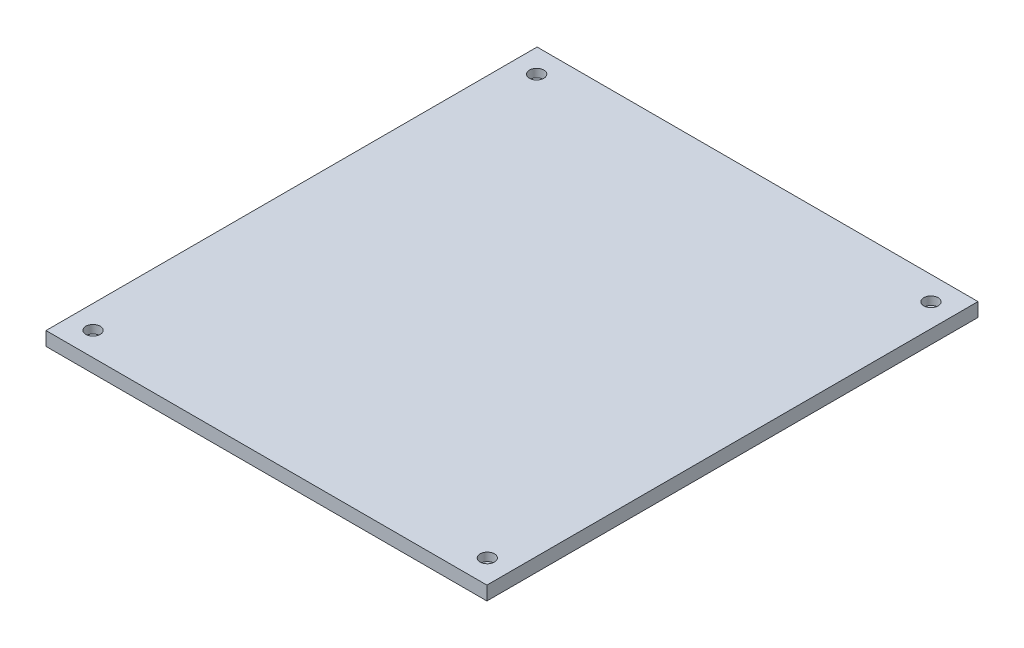
ISO-10303-21;
HEADER;
FILE_DESCRIPTION(('STEP AP214'),'2;1');
FILE_NAME('part.step','',(''),(''),'','','');
FILE_SCHEMA(('AUTOMOTIVE_DESIGN { 1 0 10303 214 1 1 1 1 }'));
ENDSEC;
DATA;
#1=APPLICATION_CONTEXT('core data for automotive mechanical design processes');
#2=APPLICATION_PROTOCOL_DEFINITION('international standard','automotive_design',2000,#1);
#3=PRODUCT_CONTEXT('',#1,'mechanical');
#4=PRODUCT('Part','Part','',(#3));
#5=PRODUCT_RELATED_PRODUCT_CATEGORY('part','',(#4));
#6=PRODUCT_DEFINITION_FORMATION('','',#4);
#7=PRODUCT_DEFINITION_CONTEXT('part definition',#1,'design');
#8=PRODUCT_DEFINITION('design','',#6,#7);
#9=PRODUCT_DEFINITION_SHAPE('','',#8);
#10=(LENGTH_UNIT() NAMED_UNIT(*) SI_UNIT(.MILLI.,.METRE.));
#11=(NAMED_UNIT(*) PLANE_ANGLE_UNIT() SI_UNIT($,.RADIAN.));
#12=(NAMED_UNIT(*) SI_UNIT($,.STERADIAN.) SOLID_ANGLE_UNIT());
#13=UNCERTAINTY_MEASURE_WITH_UNIT(LENGTH_MEASURE(1.E-05),#10,'distance_accuracy_value','');
#14=(GEOMETRIC_REPRESENTATION_CONTEXT(3) GLOBAL_UNCERTAINTY_ASSIGNED_CONTEXT((#13)) GLOBAL_UNIT_ASSIGNED_CONTEXT((#10,
#11,#12)) REPRESENTATION_CONTEXT('',''));
#15=CARTESIAN_POINT('',(0.,0.,0.));
#16=DIRECTION('',(0.,0.,1.));
#17=DIRECTION('',(1.,0.,0.));
#18=AXIS2_PLACEMENT_3D('',#15,#16,#17);
#19=CARTESIAN_POINT('',(71.5387795707747,5.,80.4966827827485));
#20=DIRECTION('',(0.,-1.,0.));
#21=DIRECTION('',(0.,0.,-1.));
#22=AXIS2_PLACEMENT_3D('',#19,#20,#21);
#23=CYLINDRICAL_SURFACE('',#22,1.5);
#24=CARTESIAN_POINT('',(71.5387795707747,0.,80.4966827827485));
#25=DIRECTION('',(0.,1.,0.));
#26=DIRECTION('',(0.,0.,1.));
#27=AXIS2_PLACEMENT_3D('',#24,#25,#26);
#28=CIRCLE('',#27,1.5);
#29=CARTESIAN_POINT('',(71.5387795707747,0.,81.9966827827485));
#30=VERTEX_POINT('',#29);
#31=EDGE_CURVE('E124',#30,#30,#28,.T.);
#32=ORIENTED_EDGE('',*,*,#31,.F.);
#33=EDGE_LOOP('',(#32));
#34=FACE_BOUND('',#33,.T.);
#35=CARTESIAN_POINT('',(71.5387795707747,2.,80.4966827827485));
#36=DIRECTION('',(0.,1.,0.));
#37=DIRECTION('',(0.,0.,1.));
#38=AXIS2_PLACEMENT_3D('',#35,#36,#37);
#39=CIRCLE('',#38,1.5);
#40=CARTESIAN_POINT('',(71.5387795707747,2.,81.9966827827485));
#41=VERTEX_POINT('',#40);
#42=EDGE_CURVE('E45',#41,#41,#39,.T.);
#43=ORIENTED_EDGE('',*,*,#42,.T.);
#44=EDGE_LOOP('',(#43));
#45=FACE_BOUND('',#44,.T.);
#46=ADVANCED_FACE('F41',(#34,#45),#23,.F.);
#47=CARTESIAN_POINT('',(-71.5387795707747,5.,-80.4966827827486));
#48=DIRECTION('',(0.,-1.,0.));
#49=DIRECTION('',(0.,0.,-1.));
#50=AXIS2_PLACEMENT_3D('',#47,#48,#49);
#51=CYLINDRICAL_SURFACE('',#50,1.5);
#52=CARTESIAN_POINT('',(-71.5387795707747,0.,-80.4966827827486));
#53=DIRECTION('',(0.,1.,0.));
#54=DIRECTION('',(0.,0.,1.));
#55=AXIS2_PLACEMENT_3D('',#52,#53,#54);
#56=CIRCLE('',#55,1.5);
#57=CARTESIAN_POINT('',(-71.5387795707747,0.,-78.9966827827486));
#58=VERTEX_POINT('',#57);
#59=EDGE_CURVE('E115',#58,#58,#56,.T.);
#60=ORIENTED_EDGE('',*,*,#59,.F.);
#61=EDGE_LOOP('',(#60));
#62=FACE_BOUND('',#61,.T.);
#63=CARTESIAN_POINT('',(-71.5387795707747,2.,-80.4966827827486));
#64=DIRECTION('',(0.,1.,0.));
#65=DIRECTION('',(0.,0.,1.));
#66=AXIS2_PLACEMENT_3D('',#63,#64,#65);
#67=CIRCLE('',#66,1.5);
#68=CARTESIAN_POINT('',(-71.5387795707747,2.,-78.9966827827486));
#69=VERTEX_POINT('',#68);
#70=EDGE_CURVE('E137',#69,#69,#67,.T.);
#71=ORIENTED_EDGE('',*,*,#70,.T.);
#72=EDGE_LOOP('',(#71));
#73=FACE_BOUND('',#72,.T.);
#74=ADVANCED_FACE('F195',(#62,#73),#51,.F.);
#75=CARTESIAN_POINT('',(80.,5.,0.));
#76=DIRECTION('',(1.,0.,0.));
#77=DIRECTION('',(0.,0.,-1.));
#78=AXIS2_PLACEMENT_3D('',#75,#76,#77);
#79=PLANE('',#78);
#80=DIRECTION('',(0.,0.,1.));
#81=VECTOR('',#80,1.);
#82=CARTESIAN_POINT('',(80.,0.,0.));
#83=LINE('',#82,#81);
#84=CARTESIAN_POINT('',(80.,0.,-89.105));
#85=VERTEX_POINT('',#84);
#86=CARTESIAN_POINT('',(80.,0.,89.105));
#87=VERTEX_POINT('',#86);
#88=EDGE_CURVE('E118',#85,#87,#83,.T.);
#89=ORIENTED_EDGE('',*,*,#88,.F.);
#90=DIRECTION('',(0.,-1.,0.));
#91=VECTOR('',#90,1.);
#92=CARTESIAN_POINT('',(80.,5.,-89.105));
#93=LINE('',#92,#91);
#94=CARTESIAN_POINT('',(80.,5.,-89.105));
#95=VERTEX_POINT('',#94);
#96=EDGE_CURVE('E11',#95,#85,#93,.T.);
#97=ORIENTED_EDGE('',*,*,#96,.F.);
#98=DIRECTION('',(0.,0.,1.));
#99=VECTOR('',#98,1.);
#100=CARTESIAN_POINT('',(80.,5.,0.));
#101=LINE('',#100,#99);
#102=CARTESIAN_POINT('',(80.,5.,89.105));
#103=VERTEX_POINT('',#102);
#104=EDGE_CURVE('E105',#95,#103,#101,.T.);
#105=ORIENTED_EDGE('',*,*,#104,.T.);
#106=DIRECTION('',(0.,-1.,0.));
#107=VECTOR('',#106,1.);
#108=CARTESIAN_POINT('',(80.,5.,89.105));
#109=LINE('',#108,#107);
#110=EDGE_CURVE('E83',#103,#87,#109,.T.);
#111=ORIENTED_EDGE('',*,*,#110,.T.);
#112=EDGE_LOOP('',(#89,#97,#105,#111));
#113=FACE_BOUND('',#112,.T.);
#114=ADVANCED_FACE('F201',(#113),#79,.T.);
#115=CARTESIAN_POINT('',(0.,5.,-89.105));
#116=DIRECTION('',(0.,0.,-1.));
#117=DIRECTION('',(-1.,0.,0.));
#118=AXIS2_PLACEMENT_3D('',#115,#116,#117);
#119=PLANE('',#118);
#120=DIRECTION('',(1.,0.,0.));
#121=VECTOR('',#120,1.);
#122=CARTESIAN_POINT('',(0.,0.,-89.105));
#123=LINE('',#122,#121);
#124=CARTESIAN_POINT('',(-80.,0.,-89.105));
#125=VERTEX_POINT('',#124);
#126=EDGE_CURVE('E95',#125,#85,#123,.T.);
#127=ORIENTED_EDGE('',*,*,#126,.F.);
#128=DIRECTION('',(0.,-1.,0.));
#129=VECTOR('',#128,1.);
#130=CARTESIAN_POINT('',(-80.,5.,-89.105));
#131=LINE('',#130,#129);
#132=CARTESIAN_POINT('',(-80.,5.,-89.105));
#133=VERTEX_POINT('',#132);
#134=EDGE_CURVE('E51',#133,#125,#131,.T.);
#135=ORIENTED_EDGE('',*,*,#134,.F.);
#136=DIRECTION('',(1.,0.,0.));
#137=VECTOR('',#136,1.);
#138=CARTESIAN_POINT('',(0.,5.,-89.105));
#139=LINE('',#138,#137);
#140=EDGE_CURVE('E93',#133,#95,#139,.T.);
#141=ORIENTED_EDGE('',*,*,#140,.T.);
#142=ORIENTED_EDGE('',*,*,#96,.T.);
#143=EDGE_LOOP('',(#127,#135,#141,#142));
#144=FACE_BOUND('',#143,.T.);
#145=ADVANCED_FACE('F91',(#144),#119,.T.);
#146=CARTESIAN_POINT('',(-80.,5.,0.));
#147=DIRECTION('',(1.,0.,0.));
#148=DIRECTION('',(0.,0.,-1.));
#149=AXIS2_PLACEMENT_3D('',#146,#147,#148);
#150=PLANE('',#149);
#151=DIRECTION('',(0.,0.,1.));
#152=VECTOR('',#151,1.);
#153=CARTESIAN_POINT('',(-80.,0.,0.));
#154=LINE('',#153,#152);
#155=CARTESIAN_POINT('',(-80.,0.,89.105));
#156=VERTEX_POINT('',#155);
#157=EDGE_CURVE('E121',#125,#156,#154,.T.);
#158=ORIENTED_EDGE('',*,*,#157,.T.);
#159=DIRECTION('',(0.,-1.,0.));
#160=VECTOR('',#159,1.);
#161=CARTESIAN_POINT('',(-80.,5.,89.105));
#162=LINE('',#161,#160);
#163=CARTESIAN_POINT('',(-80.,5.,89.105));
#164=VERTEX_POINT('',#163);
#165=EDGE_CURVE('E98',#164,#156,#162,.T.);
#166=ORIENTED_EDGE('',*,*,#165,.F.);
#167=DIRECTION('',(0.,0.,1.));
#168=VECTOR('',#167,1.);
#169=CARTESIAN_POINT('',(-80.,5.,0.));
#170=LINE('',#169,#168);
#171=EDGE_CURVE('E101',#133,#164,#170,.T.);
#172=ORIENTED_EDGE('',*,*,#171,.F.);
#173=ORIENTED_EDGE('',*,*,#134,.T.);
#174=EDGE_LOOP('',(#158,#166,#172,#173));
#175=FACE_BOUND('',#174,.T.);
#176=ADVANCED_FACE('F102',(#175),#150,.F.);
#177=CARTESIAN_POINT('',(0.,5.,89.105));
#178=DIRECTION('',(0.,0.,-1.));
#179=DIRECTION('',(-1.,0.,0.));
#180=AXIS2_PLACEMENT_3D('',#177,#178,#179);
#181=PLANE('',#180);
#182=DIRECTION('',(1.,0.,0.));
#183=VECTOR('',#182,1.);
#184=CARTESIAN_POINT('',(0.,0.,89.105));
#185=LINE('',#184,#183);
#186=EDGE_CURVE('E76',#156,#87,#185,.T.);
#187=ORIENTED_EDGE('',*,*,#186,.T.);
#188=ORIENTED_EDGE('',*,*,#110,.F.);
#189=DIRECTION('',(1.,0.,0.));
#190=VECTOR('',#189,1.);
#191=CARTESIAN_POINT('',(0.,5.,89.105));
#192=LINE('',#191,#190);
#193=EDGE_CURVE('E60',#164,#103,#192,.T.);
#194=ORIENTED_EDGE('',*,*,#193,.F.);
#195=ORIENTED_EDGE('',*,*,#165,.T.);
#196=EDGE_LOOP('',(#187,#188,#194,#195));
#197=FACE_BOUND('',#196,.T.);
#198=ADVANCED_FACE('F208',(#197),#181,.F.);
#199=CARTESIAN_POINT('',(71.5387795707748,5.,-80.4966827827485));
#200=DIRECTION('',(0.,-1.,0.));
#201=DIRECTION('',(0.,0.,-1.));
#202=AXIS2_PLACEMENT_3D('',#199,#200,#201);
#203=CYLINDRICAL_SURFACE('',#202,1.5);
#204=CARTESIAN_POINT('',(71.5387795707748,2.,-80.4966827827485));
#205=DIRECTION('',(0.,-1.,0.));
#206=DIRECTION('',(0.,0.,-1.));
#207=AXIS2_PLACEMENT_3D('',#204,#205,#206);
#208=CIRCLE('',#207,1.5);
#209=CARTESIAN_POINT('',(71.5387795707748,2.,-81.9966827827485));
#210=VERTEX_POINT('',#209);
#211=EDGE_CURVE('E134',#210,#210,#208,.F.);
#212=ORIENTED_EDGE('',*,*,#211,.T.);
#213=EDGE_LOOP('',(#212));
#214=FACE_BOUND('',#213,.T.);
#215=CARTESIAN_POINT('',(71.5387795707748,0.,-80.4966827827485));
#216=DIRECTION('',(0.,1.,0.));
#217=DIRECTION('',(0.,0.,1.));
#218=AXIS2_PLACEMENT_3D('',#215,#216,#217);
#219=CIRCLE('',#218,1.5);
#220=CARTESIAN_POINT('',(71.5387795707748,0.,-78.9966827827485));
#221=VERTEX_POINT('',#220);
#222=EDGE_CURVE('E112',#221,#221,#219,.F.);
#223=ORIENTED_EDGE('',*,*,#222,.T.);
#224=EDGE_LOOP('',(#223));
#225=FACE_BOUND('',#224,.T.);
#226=ADVANCED_FACE('F43',(#214,#225),#203,.F.);
#227=CARTESIAN_POINT('',(-71.5387795707747,5.,80.4966827827485));
#228=DIRECTION('',(0.,-1.,0.));
#229=DIRECTION('',(0.,0.,-1.));
#230=AXIS2_PLACEMENT_3D('',#227,#228,#229);
#231=CYLINDRICAL_SURFACE('',#230,1.5);
#232=CARTESIAN_POINT('',(-71.5387795707747,2.,80.4966827827485));
#233=DIRECTION('',(0.,-1.,0.));
#234=DIRECTION('',(0.,0.,-1.));
#235=AXIS2_PLACEMENT_3D('',#232,#233,#234);
#236=CIRCLE('',#235,1.5);
#237=CARTESIAN_POINT('',(-71.5387795707747,2.,78.9966827827485));
#238=VERTEX_POINT('',#237);
#239=EDGE_CURVE('E131',#238,#238,#236,.F.);
#240=ORIENTED_EDGE('',*,*,#239,.T.);
#241=EDGE_LOOP('',(#240));
#242=FACE_BOUND('',#241,.T.);
#243=CARTESIAN_POINT('',(-71.5387795707747,0.,80.4966827827485));
#244=DIRECTION('',(0.,1.,0.));
#245=DIRECTION('',(0.,0.,1.));
#246=AXIS2_PLACEMENT_3D('',#243,#244,#245);
#247=CIRCLE('',#246,1.5);
#248=CARTESIAN_POINT('',(-71.5387795707747,0.,81.9966827827485));
#249=VERTEX_POINT('',#248);
#250=EDGE_CURVE('E107',#249,#249,#247,.F.);
#251=ORIENTED_EDGE('',*,*,#250,.T.);
#252=EDGE_LOOP('',(#251));
#253=FACE_BOUND('',#252,.T.);
#254=ADVANCED_FACE('F206',(#242,#253),#231,.F.);
#255=CARTESIAN_POINT('',(0.,5.,0.));
#256=DIRECTION('',(0.,1.,0.));
#257=DIRECTION('',(0.,0.,1.));
#258=AXIS2_PLACEMENT_3D('',#255,#256,#257);
#259=PLANE('',#258);
#260=CARTESIAN_POINT('',(-71.5387795707747,5.,80.4966827827486));
#261=DIRECTION('',(0.,1.,0.));
#262=DIRECTION('',(0.,0.,-1.));
#263=AXIS2_PLACEMENT_3D('',#260,#261,#262);
#264=CIRCLE('',#263,2.6);
#265=CARTESIAN_POINT('',(-71.5387795707747,5.,77.8966827827486));
#266=VERTEX_POINT('',#265);
#267=EDGE_CURVE('E156',#266,#266,#264,.T.);
#268=ORIENTED_EDGE('',*,*,#267,.F.);
#269=EDGE_LOOP('',(#268));
#270=FACE_BOUND('',#269,.T.);
#271=CARTESIAN_POINT('',(71.5387795707747,5.,80.4966827827486));
#272=DIRECTION('',(0.,1.,0.));
#273=DIRECTION('',(0.,0.,1.));
#274=AXIS2_PLACEMENT_3D('',#271,#272,#273);
#275=CIRCLE('',#274,2.6);
#276=CARTESIAN_POINT('',(71.5387795707747,5.,83.0966827827486));
#277=VERTEX_POINT('',#276);
#278=EDGE_CURVE('E155',#277,#277,#275,.T.);
#279=ORIENTED_EDGE('',*,*,#278,.F.);
#280=EDGE_LOOP('',(#279));
#281=FACE_BOUND('',#280,.T.);
#282=CARTESIAN_POINT('',(71.5387795707747,5.,-80.4966827827486));
#283=DIRECTION('',(0.,1.,0.));
#284=DIRECTION('',(0.,0.,-1.));
#285=AXIS2_PLACEMENT_3D('',#282,#283,#284);
#286=CIRCLE('',#285,2.6);
#287=CARTESIAN_POINT('',(71.5387795707747,5.,-83.0966827827486));
#288=VERTEX_POINT('',#287);
#289=EDGE_CURVE('E171',#288,#288,#286,.T.);
#290=ORIENTED_EDGE('',*,*,#289,.F.);
#291=EDGE_LOOP('',(#290));
#292=FACE_BOUND('',#291,.T.);
#293=CARTESIAN_POINT('',(-71.5387795707747,5.,-80.4966827827486));
#294=DIRECTION('',(0.,1.,0.));
#295=DIRECTION('',(0.,0.,1.));
#296=AXIS2_PLACEMENT_3D('',#293,#294,#295);
#297=CIRCLE('',#296,2.6);
#298=CARTESIAN_POINT('',(-71.5387795707747,5.,-77.8966827827486));
#299=VERTEX_POINT('',#298);
#300=EDGE_CURVE('E169',#299,#299,#297,.T.);
#301=ORIENTED_EDGE('',*,*,#300,.F.);
#302=EDGE_LOOP('',(#301));
#303=FACE_BOUND('',#302,.T.);
#304=ORIENTED_EDGE('',*,*,#104,.F.);
#305=ORIENTED_EDGE('',*,*,#140,.F.);
#306=ORIENTED_EDGE('',*,*,#171,.T.);
#307=ORIENTED_EDGE('',*,*,#193,.T.);
#308=EDGE_LOOP('',(#304,#305,#306,#307));
#309=FACE_BOUND('',#308,.T.);
#310=ADVANCED_FACE('F104',(#270,#281,#292,#303,#309),#259,.T.);
#311=CARTESIAN_POINT('',(0.,0.,0.));
#312=DIRECTION('',(0.,1.,0.));
#313=DIRECTION('',(0.,0.,1.));
#314=AXIS2_PLACEMENT_3D('',#311,#312,#313);
#315=PLANE('',#314);
#316=ORIENTED_EDGE('',*,*,#222,.F.);
#317=EDGE_LOOP('',(#316));
#318=FACE_BOUND('',#317,.T.);
#319=ORIENTED_EDGE('',*,*,#59,.T.);
#320=EDGE_LOOP('',(#319));
#321=FACE_BOUND('',#320,.T.);
#322=ORIENTED_EDGE('',*,*,#88,.T.);
#323=ORIENTED_EDGE('',*,*,#186,.F.);
#324=ORIENTED_EDGE('',*,*,#157,.F.);
#325=ORIENTED_EDGE('',*,*,#126,.T.);
#326=EDGE_LOOP('',(#322,#323,#324,#325));
#327=FACE_BOUND('',#326,.T.);
#328=ORIENTED_EDGE('',*,*,#31,.T.);
#329=EDGE_LOOP('',(#328));
#330=FACE_BOUND('',#329,.T.);
#331=ORIENTED_EDGE('',*,*,#250,.F.);
#332=EDGE_LOOP('',(#331));
#333=FACE_BOUND('',#332,.T.);
#334=ADVANCED_FACE('F219',(#318,#321,#327,#330,#333),#315,.F.);
#335=CARTESIAN_POINT('',(-71.5387795707747,2.,-80.4966827827486));
#336=DIRECTION('',(0.,1.,0.));
#337=DIRECTION('',(0.,0.,1.));
#338=AXIS2_PLACEMENT_3D('',#335,#336,#337);
#339=CYLINDRICAL_SURFACE('',#338,2.6);
#340=CARTESIAN_POINT('',(-71.5387795707747,2.,-80.4966827827486));
#341=DIRECTION('',(0.,1.,0.));
#342=DIRECTION('',(0.,0.,1.));
#343=AXIS2_PLACEMENT_3D('',#340,#341,#342);
#344=CIRCLE('',#343,2.6);
#345=CARTESIAN_POINT('',(-71.5387795707747,2.,-77.8966827827486));
#346=VERTEX_POINT('',#345);
#347=EDGE_CURVE('E135',#346,#346,#344,.T.);
#348=ORIENTED_EDGE('',*,*,#347,.F.);
#349=EDGE_LOOP('',(#348));
#350=FACE_BOUND('',#349,.T.);
#351=ORIENTED_EDGE('',*,*,#300,.T.);
#352=EDGE_LOOP('',(#351));
#353=FACE_BOUND('',#352,.T.);
#354=ADVANCED_FACE('F222',(#350,#353),#339,.F.);
#355=CARTESIAN_POINT('',(-71.5387795707747,2.,-80.4966827827486));
#356=DIRECTION('',(0.,1.,0.));
#357=DIRECTION('',(0.,0.,1.));
#358=AXIS2_PLACEMENT_3D('',#355,#356,#357);
#359=PLANE('',#358);
#360=ORIENTED_EDGE('',*,*,#70,.F.);
#361=EDGE_LOOP('',(#360));
#362=FACE_BOUND('',#361,.T.);
#363=ORIENTED_EDGE('',*,*,#347,.T.);
#364=EDGE_LOOP('',(#363));
#365=FACE_BOUND('',#364,.T.);
#366=ADVANCED_FACE('F192',(#362,#365),#359,.T.);
#367=CARTESIAN_POINT('',(71.5387795707747,2.,-80.4966827827486));
#368=DIRECTION('',(0.,-1.,0.));
#369=DIRECTION('',(0.,0.,-1.));
#370=AXIS2_PLACEMENT_3D('',#367,#368,#369);
#371=PLANE('',#370);
#372=CARTESIAN_POINT('',(71.5387795707747,2.,-80.4966827827486));
#373=DIRECTION('',(0.,1.,0.));
#374=DIRECTION('',(0.,0.,-1.));
#375=AXIS2_PLACEMENT_3D('',#372,#373,#374);
#376=CIRCLE('',#375,2.6);
#377=CARTESIAN_POINT('',(71.5387795707747,2.,-83.0966827827486));
#378=VERTEX_POINT('',#377);
#379=EDGE_CURVE('E159',#378,#378,#376,.T.);
#380=ORIENTED_EDGE('',*,*,#379,.T.);
#381=EDGE_LOOP('',(#380));
#382=FACE_BOUND('',#381,.T.);
#383=ORIENTED_EDGE('',*,*,#211,.F.);
#384=EDGE_LOOP('',(#383));
#385=FACE_BOUND('',#384,.T.);
#386=ADVANCED_FACE('F181',(#382,#385),#371,.F.);
#387=CARTESIAN_POINT('',(71.5387795707747,2.,-80.4966827827486));
#388=DIRECTION('',(0.,1.,0.));
#389=DIRECTION('',(0.,0.,1.));
#390=AXIS2_PLACEMENT_3D('',#387,#388,#389);
#391=CYLINDRICAL_SURFACE('',#390,2.6);
#392=ORIENTED_EDGE('',*,*,#379,.F.);
#393=EDGE_LOOP('',(#392));
#394=FACE_BOUND('',#393,.T.);
#395=ORIENTED_EDGE('',*,*,#289,.T.);
#396=EDGE_LOOP('',(#395));
#397=FACE_BOUND('',#396,.T.);
#398=ADVANCED_FACE('F184',(#394,#397),#391,.F.);
#399=CARTESIAN_POINT('',(71.5387795707747,2.,80.4966827827486));
#400=DIRECTION('',(0.,1.,0.));
#401=DIRECTION('',(0.,0.,1.));
#402=AXIS2_PLACEMENT_3D('',#399,#400,#401);
#403=CYLINDRICAL_SURFACE('',#402,2.6);
#404=CARTESIAN_POINT('',(71.5387795707747,2.,80.4966827827486));
#405=DIRECTION('',(0.,1.,0.));
#406=DIRECTION('',(0.,0.,1.));
#407=AXIS2_PLACEMENT_3D('',#404,#405,#406);
#408=CIRCLE('',#407,2.6);
#409=CARTESIAN_POINT('',(71.5387795707747,2.,83.0966827827486));
#410=VERTEX_POINT('',#409);
#411=EDGE_CURVE('E153',#410,#410,#408,.T.);
#412=ORIENTED_EDGE('',*,*,#411,.F.);
#413=EDGE_LOOP('',(#412));
#414=FACE_BOUND('',#413,.T.);
#415=ORIENTED_EDGE('',*,*,#278,.T.);
#416=EDGE_LOOP('',(#415));
#417=FACE_BOUND('',#416,.T.);
#418=ADVANCED_FACE('F149',(#414,#417),#403,.F.);
#419=CARTESIAN_POINT('',(71.5387795707747,2.,80.4966827827486));
#420=DIRECTION('',(0.,1.,0.));
#421=DIRECTION('',(0.,0.,1.));
#422=AXIS2_PLACEMENT_3D('',#419,#420,#421);
#423=PLANE('',#422);
#424=ORIENTED_EDGE('',*,*,#42,.F.);
#425=EDGE_LOOP('',(#424));
#426=FACE_BOUND('',#425,.T.);
#427=ORIENTED_EDGE('',*,*,#411,.T.);
#428=EDGE_LOOP('',(#427));
#429=FACE_BOUND('',#428,.T.);
#430=ADVANCED_FACE('F145',(#426,#429),#423,.T.);
#431=CARTESIAN_POINT('',(-71.5387795707747,2.,80.4966827827486));
#432=DIRECTION('',(0.,-1.,0.));
#433=DIRECTION('',(0.,0.,-1.));
#434=AXIS2_PLACEMENT_3D('',#431,#432,#433);
#435=PLANE('',#434);
#436=CARTESIAN_POINT('',(-71.5387795707747,2.,80.4966827827486));
#437=DIRECTION('',(0.,1.,0.));
#438=DIRECTION('',(0.,0.,-1.));
#439=AXIS2_PLACEMENT_3D('',#436,#437,#438);
#440=CIRCLE('',#439,2.6);
#441=CARTESIAN_POINT('',(-71.5387795707747,2.,77.8966827827486));
#442=VERTEX_POINT('',#441);
#443=EDGE_CURVE('E162',#442,#442,#440,.T.);
#444=ORIENTED_EDGE('',*,*,#443,.T.);
#445=EDGE_LOOP('',(#444));
#446=FACE_BOUND('',#445,.T.);
#447=ORIENTED_EDGE('',*,*,#239,.F.);
#448=EDGE_LOOP('',(#447));
#449=FACE_BOUND('',#448,.T.);
#450=ADVANCED_FACE('F148',(#446,#449),#435,.F.);
#451=CARTESIAN_POINT('',(-71.5387795707747,2.,80.4966827827486));
#452=DIRECTION('',(0.,1.,0.));
#453=DIRECTION('',(0.,0.,1.));
#454=AXIS2_PLACEMENT_3D('',#451,#452,#453);
#455=CYLINDRICAL_SURFACE('',#454,2.6);
#456=ORIENTED_EDGE('',*,*,#443,.F.);
#457=EDGE_LOOP('',(#456));
#458=FACE_BOUND('',#457,.T.);
#459=ORIENTED_EDGE('',*,*,#267,.T.);
#460=EDGE_LOOP('',(#459));
#461=FACE_BOUND('',#460,.T.);
#462=ADVANCED_FACE('F239',(#458,#461),#455,.F.);
#463=CLOSED_SHELL('',(#46,#74,#114,#145,#176,#198,#226,#254,#310,#334,#354,#366,#386,#398,#418,
#430,#450,#462));
#464=MANIFOLD_SOLID_BREP('B2',#463);
#465=ADVANCED_BREP_SHAPE_REPRESENTATION('',(#18,#464),#14);
#466=SHAPE_DEFINITION_REPRESENTATION(#9,#465);
ENDSEC;
END-ISO-10303-21;
